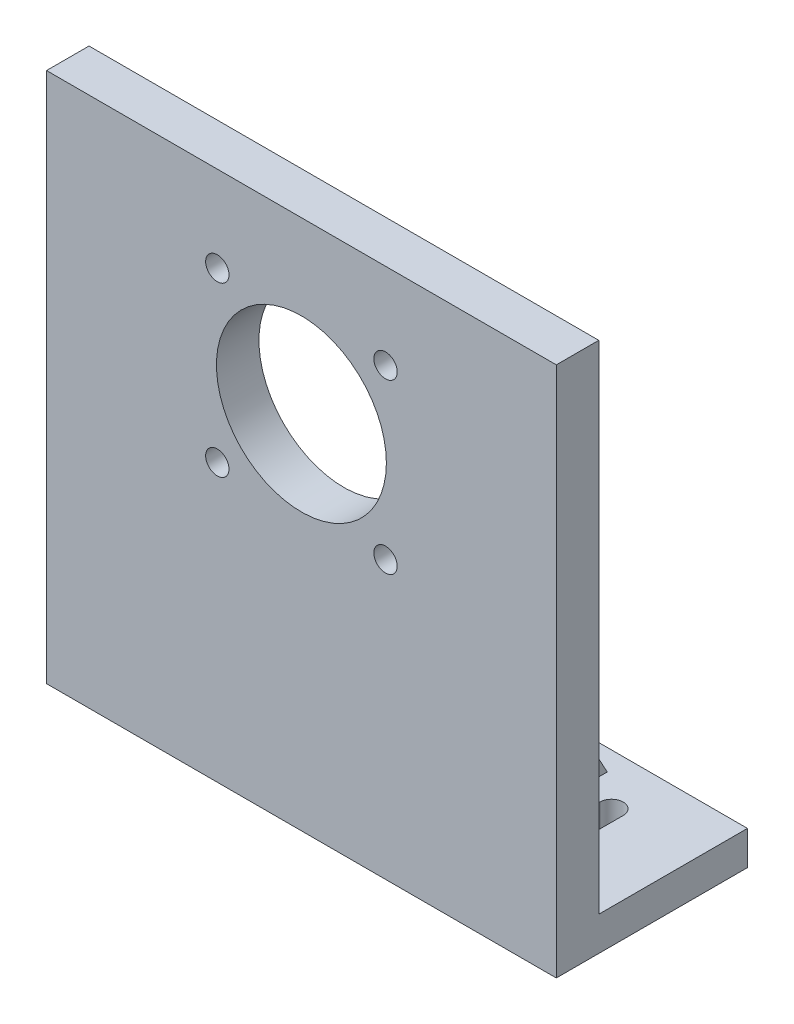
ISO-10303-21;
HEADER;
FILE_DESCRIPTION(('STEP AP214'),'2;1');
FILE_NAME('part.step','',(''),(''),'','','');
FILE_SCHEMA(('AUTOMOTIVE_DESIGN { 1 0 10303 214 1 1 1 1 }'));
ENDSEC;
DATA;
#1=APPLICATION_CONTEXT('core data for automotive mechanical design processes');
#2=APPLICATION_PROTOCOL_DEFINITION('international standard','automotive_design',2000,#1);
#3=PRODUCT_CONTEXT('',#1,'mechanical');
#4=PRODUCT('Part','Part','',(#3));
#5=PRODUCT_RELATED_PRODUCT_CATEGORY('part','',(#4));
#6=PRODUCT_DEFINITION_FORMATION('','',#4);
#7=PRODUCT_DEFINITION_CONTEXT('part definition',#1,'design');
#8=PRODUCT_DEFINITION('design','',#6,#7);
#9=PRODUCT_DEFINITION_SHAPE('','',#8);
#10=(LENGTH_UNIT() NAMED_UNIT(*) SI_UNIT(.MILLI.,.METRE.));
#11=(NAMED_UNIT(*) PLANE_ANGLE_UNIT() SI_UNIT($,.RADIAN.));
#12=(NAMED_UNIT(*) SI_UNIT($,.STERADIAN.) SOLID_ANGLE_UNIT());
#13=UNCERTAINTY_MEASURE_WITH_UNIT(LENGTH_MEASURE(1.E-05),#10,'distance_accuracy_value','');
#14=(GEOMETRIC_REPRESENTATION_CONTEXT(3) GLOBAL_UNCERTAINTY_ASSIGNED_CONTEXT((#13)) GLOBAL_UNIT_ASSIGNED_CONTEXT((#10,
#11,#12)) REPRESENTATION_CONTEXT('',''));
#15=CARTESIAN_POINT('',(0.,0.,0.));
#16=DIRECTION('',(0.,0.,1.));
#17=DIRECTION('',(1.,0.,0.));
#18=AXIS2_PLACEMENT_3D('',#15,#16,#17);
#19=CARTESIAN_POINT('',(-32.,8.,-40.));
#20=DIRECTION('',(0.,0.478852130680573,-0.877895572914384));
#21=DIRECTION('',(0.,0.877895572914384,0.478852130680573));
#22=AXIS2_PLACEMENT_3D('',#19,#20,#21);
#23=PLANE('',#22);
#24=DIRECTION('',(1.,0.,0.));
#25=VECTOR('',#24,1.);
#26=CARTESIAN_POINT('',(-32.,63.,-10.));
#27=LINE('',#26,#25);
#28=CARTESIAN_POINT('',(-32.,63.,-10.));
#29=VERTEX_POINT('',#28);
#30=CARTESIAN_POINT('',(-24.,63.,-10.));
#31=VERTEX_POINT('',#30);
#32=EDGE_CURVE('E240',#29,#31,#27,.T.);
#33=ORIENTED_EDGE('',*,*,#32,.T.);
#34=DIRECTION('',(0.,0.877895572914384,0.478852130680573));
#35=VECTOR('',#34,1.);
#36=CARTESIAN_POINT('',(-24.,8.,-40.));
#37=LINE('',#36,#35);
#38=CARTESIAN_POINT('',(-24.,8.,-40.));
#39=VERTEX_POINT('',#38);
#40=EDGE_CURVE('E194',#39,#31,#37,.T.);
#41=ORIENTED_EDGE('',*,*,#40,.F.);
#42=DIRECTION('',(1.,0.,0.));
#43=VECTOR('',#42,1.);
#44=CARTESIAN_POINT('',(-32.,8.,-40.));
#45=LINE('',#44,#43);
#46=CARTESIAN_POINT('',(-32.,8.,-40.));
#47=VERTEX_POINT('',#46);
#48=EDGE_CURVE('E200',#47,#39,#45,.T.);
#49=ORIENTED_EDGE('',*,*,#48,.F.);
#50=DIRECTION('',(0.,0.877895572914384,0.478852130680573));
#51=VECTOR('',#50,1.);
#52=CARTESIAN_POINT('',(-32.,8.,-40.));
#53=LINE('',#52,#51);
#54=EDGE_CURVE('E228',#47,#29,#53,.T.);
#55=ORIENTED_EDGE('',*,*,#54,.T.);
#56=EDGE_LOOP('',(#33,#41,#49,#55));
#57=FACE_BOUND('',#56,.T.);
#58=ADVANCED_FACE('F42',(#57),#23,.T.);
#59=CARTESIAN_POINT('',(0.,8.,0.));
#60=DIRECTION('',(0.,-1.,0.));
#61=DIRECTION('',(0.,0.,-1.));
#62=AXIS2_PLACEMENT_3D('',#59,#60,#61);
#63=PLANE('',#62);
#64=CARTESIAN_POINT('',(40.,8.,-27.5));
#65=DIRECTION('',(0.,1.,0.));
#66=DIRECTION('',(0.,0.,1.));
#67=AXIS2_PLACEMENT_3D('',#64,#65,#66);
#68=CIRCLE('',#67,2.75);
#69=CARTESIAN_POINT('',(37.25,8.,-27.5));
#70=VERTEX_POINT('',#69);
#71=CARTESIAN_POINT('',(42.75,8.,-27.5));
#72=VERTEX_POINT('',#71);
#73=EDGE_CURVE('E247',#70,#72,#68,.T.);
#74=ORIENTED_EDGE('',*,*,#73,.F.);
#75=DIRECTION('',(0.,0.,1.));
#76=VECTOR('',#75,1.);
#77=CARTESIAN_POINT('',(37.25,8.,-27.5));
#78=LINE('',#77,#76);
#79=CARTESIAN_POINT('',(37.25,8.,-33.));
#80=VERTEX_POINT('',#79);
#81=EDGE_CURVE('E258',#80,#70,#78,.T.);
#82=ORIENTED_EDGE('',*,*,#81,.F.);
#83=CARTESIAN_POINT('',(40.,8.,-33.));
#84=DIRECTION('',(0.,1.,0.));
#85=DIRECTION('',(0.,0.,1.));
#86=AXIS2_PLACEMENT_3D('',#83,#84,#85);
#87=CIRCLE('',#86,2.75);
#88=CARTESIAN_POINT('',(42.75,8.,-33.));
#89=VERTEX_POINT('',#88);
#90=EDGE_CURVE('E254',#89,#80,#87,.T.);
#91=ORIENTED_EDGE('',*,*,#90,.F.);
#92=DIRECTION('',(0.,0.,-1.));
#93=VECTOR('',#92,1.);
#94=CARTESIAN_POINT('',(42.75,8.,-27.5));
#95=LINE('',#94,#93);
#96=EDGE_CURVE('E250',#72,#89,#95,.T.);
#97=ORIENTED_EDGE('',*,*,#96,.F.);
#98=EDGE_LOOP('',(#74,#82,#91,#97));
#99=FACE_BOUND('',#98,.T.);
#100=CARTESIAN_POINT('',(-40.,8.,-27.5));
#101=DIRECTION('',(0.,1.,0.));
#102=DIRECTION('',(0.,0.,1.));
#103=AXIS2_PLACEMENT_3D('',#100,#101,#102);
#104=CIRCLE('',#103,2.75);
#105=CARTESIAN_POINT('',(-42.75,8.,-27.5));
#106=VERTEX_POINT('',#105);
#107=CARTESIAN_POINT('',(-37.25,8.,-27.5));
#108=VERTEX_POINT('',#107);
#109=EDGE_CURVE('E290',#106,#108,#104,.T.);
#110=ORIENTED_EDGE('',*,*,#109,.F.);
#111=DIRECTION('',(0.,0.,1.));
#112=VECTOR('',#111,1.);
#113=CARTESIAN_POINT('',(-42.75,8.,-27.5));
#114=LINE('',#113,#112);
#115=CARTESIAN_POINT('',(-42.75,8.,-33.));
#116=VERTEX_POINT('',#115);
#117=EDGE_CURVE('E301',#116,#106,#114,.T.);
#118=ORIENTED_EDGE('',*,*,#117,.F.);
#119=CARTESIAN_POINT('',(-40.,8.,-33.));
#120=DIRECTION('',(0.,1.,0.));
#121=DIRECTION('',(0.,0.,1.));
#122=AXIS2_PLACEMENT_3D('',#119,#120,#121);
#123=CIRCLE('',#122,2.75);
#124=CARTESIAN_POINT('',(-37.25,8.,-33.));
#125=VERTEX_POINT('',#124);
#126=EDGE_CURVE('E297',#125,#116,#123,.T.);
#127=ORIENTED_EDGE('',*,*,#126,.F.);
#128=DIRECTION('',(0.,0.,-1.));
#129=VECTOR('',#128,1.);
#130=CARTESIAN_POINT('',(-37.25,8.,-27.5));
#131=LINE('',#130,#129);
#132=EDGE_CURVE('E293',#108,#125,#131,.T.);
#133=ORIENTED_EDGE('',*,*,#132,.F.);
#134=EDGE_LOOP('',(#110,#118,#127,#133));
#135=FACE_BOUND('',#134,.T.);
#136=DIRECTION('',(0.,0.,-1.));
#137=VECTOR('',#136,1.);
#138=CARTESIAN_POINT('',(-32.,8.,-10.));
#139=LINE('',#138,#137);
#140=CARTESIAN_POINT('',(-32.,8.,-10.));
#141=VERTEX_POINT('',#140);
#142=EDGE_CURVE('E224',#141,#47,#139,.T.);
#143=ORIENTED_EDGE('',*,*,#142,.T.);
#144=ORIENTED_EDGE('',*,*,#48,.T.);
#145=DIRECTION('',(0.,0.,-1.));
#146=VECTOR('',#145,1.);
#147=CARTESIAN_POINT('',(-24.,8.,-10.));
#148=LINE('',#147,#146);
#149=CARTESIAN_POINT('',(-24.,8.,-10.));
#150=VERTEX_POINT('',#149);
#151=EDGE_CURVE('E197',#150,#39,#148,.T.);
#152=ORIENTED_EDGE('',*,*,#151,.F.);
#153=DIRECTION('',(1.,0.,0.));
#154=VECTOR('',#153,1.);
#155=CARTESIAN_POINT('',(-24.,8.,-10.));
#156=LINE('',#155,#154);
#157=CARTESIAN_POINT('',(24.,8.,-10.));
#158=VERTEX_POINT('',#157);
#159=EDGE_CURVE('E183',#150,#158,#156,.T.);
#160=ORIENTED_EDGE('',*,*,#159,.T.);
#161=DIRECTION('',(0.,0.,-1.));
#162=VECTOR('',#161,1.);
#163=CARTESIAN_POINT('',(24.,8.,-10.));
#164=LINE('',#163,#162);
#165=CARTESIAN_POINT('',(24.,8.,-40.));
#166=VERTEX_POINT('',#165);
#167=EDGE_CURVE('E211',#158,#166,#164,.T.);
#168=ORIENTED_EDGE('',*,*,#167,.T.);
#169=CARTESIAN_POINT('',(32.,8.,-40.));
#170=VERTEX_POINT('',#169);
#171=EDGE_CURVE('E232',#166,#170,#45,.T.);
#172=ORIENTED_EDGE('',*,*,#171,.T.);
#173=DIRECTION('',(0.,0.,-1.));
#174=VECTOR('',#173,1.);
#175=CARTESIAN_POINT('',(32.,8.,-10.));
#176=LINE('',#175,#174);
#177=CARTESIAN_POINT('',(32.,8.,-10.));
#178=VERTEX_POINT('',#177);
#179=EDGE_CURVE('E235',#178,#170,#176,.T.);
#180=ORIENTED_EDGE('',*,*,#179,.F.);
#181=DIRECTION('',(1.,0.,0.));
#182=VECTOR('',#181,1.);
#183=CARTESIAN_POINT('',(-60.,8.,-10.));
#184=LINE('',#183,#182);
#185=CARTESIAN_POINT('',(60.,8.,-10.));
#186=VERTEX_POINT('',#185);
#187=EDGE_CURVE('E337',#178,#186,#184,.T.);
#188=ORIENTED_EDGE('',*,*,#187,.T.);
#189=DIRECTION('',(0.,0.,-1.));
#190=VECTOR('',#189,1.);
#191=CARTESIAN_POINT('',(60.,8.,-10.));
#192=LINE('',#191,#190);
#193=CARTESIAN_POINT('',(60.,8.,-45.));
#194=VERTEX_POINT('',#193);
#195=EDGE_CURVE('E342',#186,#194,#192,.T.);
#196=ORIENTED_EDGE('',*,*,#195,.T.);
#197=DIRECTION('',(-1.,0.,0.));
#198=VECTOR('',#197,1.);
#199=CARTESIAN_POINT('',(-60.,8.,-45.));
#200=LINE('',#199,#198);
#201=CARTESIAN_POINT('',(-60.,8.,-45.));
#202=VERTEX_POINT('',#201);
#203=EDGE_CURVE('E345',#194,#202,#200,.T.);
#204=ORIENTED_EDGE('',*,*,#203,.T.);
#205=DIRECTION('',(0.,0.,1.));
#206=VECTOR('',#205,1.);
#207=CARTESIAN_POINT('',(-60.,8.,-10.));
#208=LINE('',#207,#206);
#209=CARTESIAN_POINT('',(-60.,8.,-10.));
#210=VERTEX_POINT('',#209);
#211=EDGE_CURVE('E333',#202,#210,#208,.T.);
#212=ORIENTED_EDGE('',*,*,#211,.T.);
#213=EDGE_CURVE('E338',#210,#141,#184,.T.);
#214=ORIENTED_EDGE('',*,*,#213,.T.);
#215=EDGE_LOOP('',(#143,#144,#152,#160,#168,#172,#180,#188,#196,#204,#212,#214));
#216=FACE_BOUND('',#215,.T.);
#217=ADVANCED_FACE('F199',(#99,#135,#216),#63,.F.);
#218=CARTESIAN_POINT('',(-60.,0.,-10.));
#219=DIRECTION('',(-1.,0.,0.));
#220=DIRECTION('',(0.,0.,1.));
#221=AXIS2_PLACEMENT_3D('',#218,#219,#220);
#222=PLANE('',#221);
#223=DIRECTION('',(0.,-1.,0.));
#224=VECTOR('',#223,1.);
#225=CARTESIAN_POINT('',(-60.,0.,0.));
#226=LINE('',#225,#224);
#227=CARTESIAN_POINT('',(-60.,125.,0.));
#228=VERTEX_POINT('',#227);
#229=CARTESIAN_POINT('',(-60.,0.,0.));
#230=VERTEX_POINT('',#229);
#231=EDGE_CURVE('E396',#228,#230,#226,.T.);
#232=ORIENTED_EDGE('',*,*,#231,.F.);
#233=DIRECTION('',(0.,0.,1.));
#234=VECTOR('',#233,1.);
#235=CARTESIAN_POINT('',(-60.,125.,-10.));
#236=LINE('',#235,#234);
#237=CARTESIAN_POINT('',(-60.,125.,-10.));
#238=VERTEX_POINT('',#237);
#239=EDGE_CURVE('E11',#238,#228,#236,.T.);
#240=ORIENTED_EDGE('',*,*,#239,.F.);
#241=DIRECTION('',(0.,-1.,0.));
#242=VECTOR('',#241,1.);
#243=CARTESIAN_POINT('',(-60.,0.,-10.));
#244=LINE('',#243,#242);
#245=EDGE_CURVE('E400',#238,#210,#244,.T.);
#246=ORIENTED_EDGE('',*,*,#245,.T.);
#247=ORIENTED_EDGE('',*,*,#211,.F.);
#248=DIRECTION('',(0.,-1.,0.));
#249=VECTOR('',#248,1.);
#250=CARTESIAN_POINT('',(-60.,8.,-45.));
#251=LINE('',#250,#249);
#252=CARTESIAN_POINT('',(-60.,0.,-45.));
#253=VERTEX_POINT('',#252);
#254=EDGE_CURVE('E348',#202,#253,#251,.T.);
#255=ORIENTED_EDGE('',*,*,#254,.T.);
#256=DIRECTION('',(0.,0.,1.));
#257=VECTOR('',#256,1.);
#258=CARTESIAN_POINT('',(-60.,0.,-10.));
#259=LINE('',#258,#257);
#260=EDGE_CURVE('E46',#253,#230,#259,.T.);
#261=ORIENTED_EDGE('',*,*,#260,.T.);
#262=EDGE_LOOP('',(#232,#240,#246,#247,#255,#261));
#263=FACE_BOUND('',#262,.T.);
#264=ADVANCED_FACE('F44',(#263),#222,.T.);
#265=CARTESIAN_POINT('',(-60.,125.,-10.));
#266=DIRECTION('',(0.,1.,0.));
#267=DIRECTION('',(0.,0.,1.));
#268=AXIS2_PLACEMENT_3D('',#265,#266,#267);
#269=PLANE('',#268);
#270=DIRECTION('',(-1.,0.,0.));
#271=VECTOR('',#270,1.);
#272=CARTESIAN_POINT('',(-60.,125.,0.));
#273=LINE('',#272,#271);
#274=CARTESIAN_POINT('',(60.,125.,0.));
#275=VERTEX_POINT('',#274);
#276=EDGE_CURVE('E405',#275,#228,#273,.T.);
#277=ORIENTED_EDGE('',*,*,#276,.F.);
#278=DIRECTION('',(0.,0.,1.));
#279=VECTOR('',#278,1.);
#280=CARTESIAN_POINT('',(60.,125.,-10.));
#281=LINE('',#280,#279);
#282=CARTESIAN_POINT('',(60.,125.,-10.));
#283=VERTEX_POINT('',#282);
#284=EDGE_CURVE('E52',#283,#275,#281,.T.);
#285=ORIENTED_EDGE('',*,*,#284,.F.);
#286=DIRECTION('',(-1.,0.,0.));
#287=VECTOR('',#286,1.);
#288=CARTESIAN_POINT('',(-60.,125.,-10.));
#289=LINE('',#288,#287);
#290=EDGE_CURVE('E408',#283,#238,#289,.T.);
#291=ORIENTED_EDGE('',*,*,#290,.T.);
#292=ORIENTED_EDGE('',*,*,#239,.T.);
#293=EDGE_LOOP('',(#277,#285,#291,#292));
#294=FACE_BOUND('',#293,.T.);
#295=ADVANCED_FACE('F445',(#294),#269,.T.);
#296=CARTESIAN_POINT('',(60.,0.,-10.));
#297=DIRECTION('',(1.,0.,0.));
#298=DIRECTION('',(0.,0.,-1.));
#299=AXIS2_PLACEMENT_3D('',#296,#297,#298);
#300=PLANE('',#299);
#301=DIRECTION('',(0.,1.,0.));
#302=VECTOR('',#301,1.);
#303=CARTESIAN_POINT('',(60.,0.,0.));
#304=LINE('',#303,#302);
#305=CARTESIAN_POINT('',(60.,0.,0.));
#306=VERTEX_POINT('',#305);
#307=EDGE_CURVE('E419',#306,#275,#304,.T.);
#308=ORIENTED_EDGE('',*,*,#307,.F.);
#309=DIRECTION('',(0.,0.,1.));
#310=VECTOR('',#309,1.);
#311=CARTESIAN_POINT('',(60.,0.,-10.));
#312=LINE('',#311,#310);
#313=CARTESIAN_POINT('',(60.,0.,-45.));
#314=VERTEX_POINT('',#313);
#315=EDGE_CURVE('E427',#314,#306,#312,.T.);
#316=ORIENTED_EDGE('',*,*,#315,.F.);
#317=DIRECTION('',(0.,-1.,0.));
#318=VECTOR('',#317,1.);
#319=CARTESIAN_POINT('',(60.,8.,-45.));
#320=LINE('',#319,#318);
#321=EDGE_CURVE('E355',#194,#314,#320,.T.);
#322=ORIENTED_EDGE('',*,*,#321,.F.);
#323=ORIENTED_EDGE('',*,*,#195,.F.);
#324=DIRECTION('',(0.,1.,0.));
#325=VECTOR('',#324,1.);
#326=CARTESIAN_POINT('',(60.,0.,-10.));
#327=LINE('',#326,#325);
#328=EDGE_CURVE('E404',#186,#283,#327,.T.);
#329=ORIENTED_EDGE('',*,*,#328,.T.);
#330=ORIENTED_EDGE('',*,*,#284,.T.);
#331=EDGE_LOOP('',(#308,#316,#322,#323,#329,#330));
#332=FACE_BOUND('',#331,.T.);
#333=ADVANCED_FACE('F455',(#332),#300,.T.);
#334=CARTESIAN_POINT('',(-60.,0.,-10.));
#335=DIRECTION('',(0.,-1.,0.));
#336=DIRECTION('',(0.,0.,-1.));
#337=AXIS2_PLACEMENT_3D('',#334,#335,#336);
#338=PLANE('',#337);
#339=DIRECTION('',(1.,0.,0.));
#340=VECTOR('',#339,1.);
#341=CARTESIAN_POINT('',(-60.,0.,0.));
#342=LINE('',#341,#340);
#343=EDGE_CURVE('E415',#230,#306,#342,.T.);
#344=ORIENTED_EDGE('',*,*,#343,.F.);
#345=ORIENTED_EDGE('',*,*,#260,.F.);
#346=DIRECTION('',(-1.,0.,0.));
#347=VECTOR('',#346,1.);
#348=CARTESIAN_POINT('',(-60.,0.,-45.));
#349=LINE('',#348,#347);
#350=EDGE_CURVE('E332',#314,#253,#349,.T.);
#351=ORIENTED_EDGE('',*,*,#350,.F.);
#352=ORIENTED_EDGE('',*,*,#315,.T.);
#353=EDGE_LOOP('',(#344,#345,#351,#352));
#354=FACE_BOUND('',#353,.T.);
#355=DIRECTION('',(0.,0.,1.));
#356=VECTOR('',#355,1.);
#357=CARTESIAN_POINT('',(-42.75,0.,-27.5));
#358=LINE('',#357,#356);
#359=CARTESIAN_POINT('',(-42.75,0.,-33.));
#360=VERTEX_POINT('',#359);
#361=CARTESIAN_POINT('',(-42.75,0.,-27.5));
#362=VERTEX_POINT('',#361);
#363=EDGE_CURVE('E294',#360,#362,#358,.T.);
#364=ORIENTED_EDGE('',*,*,#363,.T.);
#365=CARTESIAN_POINT('',(-40.,0.,-27.5));
#366=DIRECTION('',(0.,1.,0.));
#367=DIRECTION('',(0.,0.,1.));
#368=AXIS2_PLACEMENT_3D('',#365,#366,#367);
#369=CIRCLE('',#368,2.75);
#370=CARTESIAN_POINT('',(-37.25,0.,-27.5));
#371=VERTEX_POINT('',#370);
#372=EDGE_CURVE('E289',#362,#371,#369,.T.);
#373=ORIENTED_EDGE('',*,*,#372,.T.);
#374=DIRECTION('',(0.,0.,-1.));
#375=VECTOR('',#374,1.);
#376=CARTESIAN_POINT('',(-37.25,0.,-27.5));
#377=LINE('',#376,#375);
#378=CARTESIAN_POINT('',(-37.25,0.,-33.));
#379=VERTEX_POINT('',#378);
#380=EDGE_CURVE('E308',#371,#379,#377,.T.);
#381=ORIENTED_EDGE('',*,*,#380,.T.);
#382=CARTESIAN_POINT('',(-40.,0.,-33.));
#383=DIRECTION('',(0.,1.,0.));
#384=DIRECTION('',(0.,0.,1.));
#385=AXIS2_PLACEMENT_3D('',#382,#383,#384);
#386=CIRCLE('',#385,2.75);
#387=EDGE_CURVE('E312',#379,#360,#386,.T.);
#388=ORIENTED_EDGE('',*,*,#387,.T.);
#389=EDGE_LOOP('',(#364,#373,#381,#388));
#390=FACE_BOUND('',#389,.T.);
#391=DIRECTION('',(0.,0.,1.));
#392=VECTOR('',#391,1.);
#393=CARTESIAN_POINT('',(37.25,0.,-27.5));
#394=LINE('',#393,#392);
#395=CARTESIAN_POINT('',(37.25,0.,-33.));
#396=VERTEX_POINT('',#395);
#397=CARTESIAN_POINT('',(37.25,0.,-27.5));
#398=VERTEX_POINT('',#397);
#399=EDGE_CURVE('E251',#396,#398,#394,.T.);
#400=ORIENTED_EDGE('',*,*,#399,.T.);
#401=CARTESIAN_POINT('',(40.,0.,-27.5));
#402=DIRECTION('',(0.,1.,0.));
#403=DIRECTION('',(0.,0.,1.));
#404=AXIS2_PLACEMENT_3D('',#401,#402,#403);
#405=CIRCLE('',#404,2.75);
#406=CARTESIAN_POINT('',(42.75,0.,-27.5));
#407=VERTEX_POINT('',#406);
#408=EDGE_CURVE('E243',#398,#407,#405,.T.);
#409=ORIENTED_EDGE('',*,*,#408,.T.);
#410=DIRECTION('',(0.,0.,-1.));
#411=VECTOR('',#410,1.);
#412=CARTESIAN_POINT('',(42.75,0.,-27.5));
#413=LINE('',#412,#411);
#414=CARTESIAN_POINT('',(42.75,0.,-33.));
#415=VERTEX_POINT('',#414);
#416=EDGE_CURVE('E265',#407,#415,#413,.T.);
#417=ORIENTED_EDGE('',*,*,#416,.T.);
#418=CARTESIAN_POINT('',(40.,0.,-33.));
#419=DIRECTION('',(0.,1.,0.));
#420=DIRECTION('',(0.,0.,1.));
#421=AXIS2_PLACEMENT_3D('',#418,#419,#420);
#422=CIRCLE('',#421,2.75);
#423=EDGE_CURVE('E269',#415,#396,#422,.T.);
#424=ORIENTED_EDGE('',*,*,#423,.T.);
#425=EDGE_LOOP('',(#400,#409,#417,#424));
#426=FACE_BOUND('',#425,.T.);
#427=ADVANCED_FACE('F438',(#354,#390,#426),#338,.T.);
#428=CARTESIAN_POINT('',(0.,0.,-10.));
#429=DIRECTION('',(0.,0.,-1.));
#430=DIRECTION('',(-1.,0.,0.));
#431=AXIS2_PLACEMENT_3D('',#428,#429,#430);
#432=PLANE('',#431);
#433=CARTESIAN_POINT('',(-19.7989898732233,65.2010101267767,-10.));
#434=DIRECTION('',(0.,0.,1.));
#435=DIRECTION('',(1.,0.,0.));
#436=AXIS2_PLACEMENT_3D('',#433,#434,#435);
#437=CIRCLE('',#436,2.75);
#438=CARTESIAN_POINT('',(-17.0489898732233,65.2010101267767,-10.));
#439=VERTEX_POINT('',#438);
#440=EDGE_CURVE('E368',#439,#439,#437,.T.);
#441=ORIENTED_EDGE('',*,*,#440,.T.);
#442=EDGE_LOOP('',(#441));
#443=FACE_BOUND('',#442,.T.);
#444=CARTESIAN_POINT('',(19.7989898732233,65.2010101267767,-10.));
#445=DIRECTION('',(0.,0.,1.));
#446=DIRECTION('',(1.,0.,0.));
#447=AXIS2_PLACEMENT_3D('',#444,#445,#446);
#448=CIRCLE('',#447,2.75);
#449=CARTESIAN_POINT('',(22.5489898732233,65.2010101267767,-10.));
#450=VERTEX_POINT('',#449);
#451=EDGE_CURVE('E360',#450,#450,#448,.T.);
#452=ORIENTED_EDGE('',*,*,#451,.T.);
#453=EDGE_LOOP('',(#452));
#454=FACE_BOUND('',#453,.T.);
#455=DIRECTION('',(0.,-1.,0.));
#456=VECTOR('',#455,1.);
#457=CARTESIAN_POINT('',(-24.,63.,-10.));
#458=LINE('',#457,#456);
#459=EDGE_CURVE('E189',#31,#150,#458,.T.);
#460=ORIENTED_EDGE('',*,*,#459,.F.);
#461=ORIENTED_EDGE('',*,*,#32,.F.);
#462=DIRECTION('',(0.,-1.,0.));
#463=VECTOR('',#462,1.);
#464=CARTESIAN_POINT('',(-32.,63.,-10.));
#465=LINE('',#464,#463);
#466=EDGE_CURVE('E220',#29,#141,#465,.T.);
#467=ORIENTED_EDGE('',*,*,#466,.T.);
#468=ORIENTED_EDGE('',*,*,#213,.F.);
#469=ORIENTED_EDGE('',*,*,#245,.F.);
#470=ORIENTED_EDGE('',*,*,#290,.F.);
#471=ORIENTED_EDGE('',*,*,#328,.F.);
#472=ORIENTED_EDGE('',*,*,#187,.F.);
#473=DIRECTION('',(0.,-1.,0.));
#474=VECTOR('',#473,1.);
#475=CARTESIAN_POINT('',(32.,63.,-10.));
#476=LINE('',#475,#474);
#477=CARTESIAN_POINT('',(32.,63.,-10.));
#478=VERTEX_POINT('',#477);
#479=EDGE_CURVE('E68',#478,#178,#476,.T.);
#480=ORIENTED_EDGE('',*,*,#479,.F.);
#481=CARTESIAN_POINT('',(24.,63.,-10.));
#482=VERTEX_POINT('',#481);
#483=EDGE_CURVE('E244',#482,#478,#27,.T.);
#484=ORIENTED_EDGE('',*,*,#483,.F.);
#485=DIRECTION('',(0.,-1.,0.));
#486=VECTOR('',#485,1.);
#487=CARTESIAN_POINT('',(24.,63.,-10.));
#488=LINE('',#487,#486);
#489=EDGE_CURVE('E60',#482,#158,#488,.T.);
#490=ORIENTED_EDGE('',*,*,#489,.T.);
#491=ORIENTED_EDGE('',*,*,#159,.F.);
#492=EDGE_LOOP('',(#460,#461,#467,#468,#469,#470,#471,#472,#480,#484,#490,#491));
#493=FACE_BOUND('',#492,.T.);
#494=CARTESIAN_POINT('',(-19.7989898732233,104.798989873223,-10.));
#495=DIRECTION('',(0.,0.,1.));
#496=DIRECTION('',(1.,0.,0.));
#497=AXIS2_PLACEMENT_3D('',#494,#495,#496);
#498=CIRCLE('',#497,2.75);
#499=CARTESIAN_POINT('',(-17.0489898732233,104.798989873223,-10.));
#500=VERTEX_POINT('',#499);
#501=EDGE_CURVE('E376',#500,#500,#498,.T.);
#502=ORIENTED_EDGE('',*,*,#501,.T.);
#503=EDGE_LOOP('',(#502));
#504=FACE_BOUND('',#503,.T.);
#505=CARTESIAN_POINT('',(19.7989898732233,104.798989873223,-10.));
#506=DIRECTION('',(0.,0.,1.));
#507=DIRECTION('',(1.,0.,0.));
#508=AXIS2_PLACEMENT_3D('',#505,#506,#507);
#509=CIRCLE('',#508,2.75);
#510=CARTESIAN_POINT('',(22.5489898732233,104.798989873223,-10.));
#511=VERTEX_POINT('',#510);
#512=EDGE_CURVE('E384',#511,#511,#509,.T.);
#513=ORIENTED_EDGE('',*,*,#512,.T.);
#514=EDGE_LOOP('',(#513));
#515=FACE_BOUND('',#514,.T.);
#516=CARTESIAN_POINT('',(0.,85.,-10.));
#517=DIRECTION('',(0.,0.,1.));
#518=DIRECTION('',(1.,0.,0.));
#519=AXIS2_PLACEMENT_3D('',#516,#517,#518);
#520=CIRCLE('',#519,20.);
#521=CARTESIAN_POINT('',(20.,85.,-10.));
#522=VERTEX_POINT('',#521);
#523=EDGE_CURVE('E392',#522,#522,#520,.T.);
#524=ORIENTED_EDGE('',*,*,#523,.T.);
#525=EDGE_LOOP('',(#524));
#526=FACE_BOUND('',#525,.T.);
#527=ADVANCED_FACE('F185',(#443,#454,#493,#504,#515,#526),#432,.T.);
#528=CARTESIAN_POINT('',(0.,0.,0.));
#529=DIRECTION('',(0.,0.,-1.));
#530=DIRECTION('',(-1.,0.,0.));
#531=AXIS2_PLACEMENT_3D('',#528,#529,#530);
#532=PLANE('',#531);
#533=CARTESIAN_POINT('',(19.7989898732233,65.2010101267767,0.));
#534=DIRECTION('',(0.,0.,1.));
#535=DIRECTION('',(1.,0.,0.));
#536=AXIS2_PLACEMENT_3D('',#533,#534,#535);
#537=CIRCLE('',#536,2.75);
#538=CARTESIAN_POINT('',(22.5489898732233,65.2010101267767,0.));
#539=VERTEX_POINT('',#538);
#540=EDGE_CURVE('E359',#539,#539,#537,.T.);
#541=ORIENTED_EDGE('',*,*,#540,.F.);
#542=EDGE_LOOP('',(#541));
#543=FACE_BOUND('',#542,.T.);
#544=CARTESIAN_POINT('',(-19.7989898732233,65.2010101267767,0.));
#545=DIRECTION('',(0.,0.,1.));
#546=DIRECTION('',(1.,0.,0.));
#547=AXIS2_PLACEMENT_3D('',#544,#545,#546);
#548=CIRCLE('',#547,2.75);
#549=CARTESIAN_POINT('',(-17.0489898732233,65.2010101267767,0.));
#550=VERTEX_POINT('',#549);
#551=EDGE_CURVE('E364',#550,#550,#548,.T.);
#552=ORIENTED_EDGE('',*,*,#551,.F.);
#553=EDGE_LOOP('',(#552));
#554=FACE_BOUND('',#553,.T.);
#555=CARTESIAN_POINT('',(-19.7989898732233,104.798989873223,0.));
#556=DIRECTION('',(0.,0.,1.));
#557=DIRECTION('',(1.,0.,0.));
#558=AXIS2_PLACEMENT_3D('',#555,#556,#557);
#559=CIRCLE('',#558,2.75);
#560=CARTESIAN_POINT('',(-17.0489898732233,104.798989873223,0.));
#561=VERTEX_POINT('',#560);
#562=EDGE_CURVE('E372',#561,#561,#559,.T.);
#563=ORIENTED_EDGE('',*,*,#562,.F.);
#564=EDGE_LOOP('',(#563));
#565=FACE_BOUND('',#564,.T.);
#566=CARTESIAN_POINT('',(19.7989898732233,104.798989873223,0.));
#567=DIRECTION('',(0.,0.,1.));
#568=DIRECTION('',(1.,0.,0.));
#569=AXIS2_PLACEMENT_3D('',#566,#567,#568);
#570=CIRCLE('',#569,2.75);
#571=CARTESIAN_POINT('',(22.5489898732233,104.798989873223,0.));
#572=VERTEX_POINT('',#571);
#573=EDGE_CURVE('E380',#572,#572,#570,.T.);
#574=ORIENTED_EDGE('',*,*,#573,.F.);
#575=EDGE_LOOP('',(#574));
#576=FACE_BOUND('',#575,.T.);
#577=CARTESIAN_POINT('',(0.,85.,0.));
#578=DIRECTION('',(0.,0.,1.));
#579=DIRECTION('',(1.,0.,0.));
#580=AXIS2_PLACEMENT_3D('',#577,#578,#579);
#581=CIRCLE('',#580,20.);
#582=CARTESIAN_POINT('',(20.,85.,0.));
#583=VERTEX_POINT('',#582);
#584=EDGE_CURVE('E388',#583,#583,#581,.T.);
#585=ORIENTED_EDGE('',*,*,#584,.F.);
#586=EDGE_LOOP('',(#585));
#587=FACE_BOUND('',#586,.T.);
#588=ORIENTED_EDGE('',*,*,#231,.T.);
#589=ORIENTED_EDGE('',*,*,#343,.T.);
#590=ORIENTED_EDGE('',*,*,#307,.T.);
#591=ORIENTED_EDGE('',*,*,#276,.T.);
#592=EDGE_LOOP('',(#588,#589,#590,#591));
#593=FACE_BOUND('',#592,.T.);
#594=ADVANCED_FACE('F441',(#543,#554,#565,#576,#587,#593),#532,.F.);
#595=CARTESIAN_POINT('',(0.,85.,-10.));
#596=DIRECTION('',(0.,0.,1.));
#597=DIRECTION('',(1.,0.,0.));
#598=AXIS2_PLACEMENT_3D('',#595,#596,#597);
#599=CYLINDRICAL_SURFACE('',#598,20.);
#600=ORIENTED_EDGE('',*,*,#523,.F.);
#601=EDGE_LOOP('',(#600));
#602=FACE_BOUND('',#601,.T.);
#603=ORIENTED_EDGE('',*,*,#584,.T.);
#604=EDGE_LOOP('',(#603));
#605=FACE_BOUND('',#604,.T.);
#606=ADVANCED_FACE('F541',(#602,#605),#599,.F.);
#607=CARTESIAN_POINT('',(19.7989898732233,104.798989873223,-10.));
#608=DIRECTION('',(0.,0.,1.));
#609=DIRECTION('',(1.,0.,0.));
#610=AXIS2_PLACEMENT_3D('',#607,#608,#609);
#611=CYLINDRICAL_SURFACE('',#610,2.75);
#612=ORIENTED_EDGE('',*,*,#512,.F.);
#613=EDGE_LOOP('',(#612));
#614=FACE_BOUND('',#613,.T.);
#615=ORIENTED_EDGE('',*,*,#573,.T.);
#616=EDGE_LOOP('',(#615));
#617=FACE_BOUND('',#616,.T.);
#618=ADVANCED_FACE('F537',(#614,#617),#611,.F.);
#619=CARTESIAN_POINT('',(-19.7989898732233,104.798989873223,-10.));
#620=DIRECTION('',(0.,0.,1.));
#621=DIRECTION('',(1.,0.,0.));
#622=AXIS2_PLACEMENT_3D('',#619,#620,#621);
#623=CYLINDRICAL_SURFACE('',#622,2.75);
#624=ORIENTED_EDGE('',*,*,#501,.F.);
#625=EDGE_LOOP('',(#624));
#626=FACE_BOUND('',#625,.T.);
#627=ORIENTED_EDGE('',*,*,#562,.T.);
#628=EDGE_LOOP('',(#627));
#629=FACE_BOUND('',#628,.T.);
#630=ADVANCED_FACE('F533',(#626,#629),#623,.F.);
#631=CARTESIAN_POINT('',(-19.7989898732233,65.2010101267767,-10.));
#632=DIRECTION('',(0.,0.,1.));
#633=DIRECTION('',(1.,0.,0.));
#634=AXIS2_PLACEMENT_3D('',#631,#632,#633);
#635=CYLINDRICAL_SURFACE('',#634,2.75);
#636=ORIENTED_EDGE('',*,*,#440,.F.);
#637=EDGE_LOOP('',(#636));
#638=FACE_BOUND('',#637,.T.);
#639=ORIENTED_EDGE('',*,*,#551,.T.);
#640=EDGE_LOOP('',(#639));
#641=FACE_BOUND('',#640,.T.);
#642=ADVANCED_FACE('F529',(#638,#641),#635,.F.);
#643=CARTESIAN_POINT('',(19.7989898732233,65.2010101267767,-10.));
#644=DIRECTION('',(0.,0.,1.));
#645=DIRECTION('',(1.,0.,0.));
#646=AXIS2_PLACEMENT_3D('',#643,#644,#645);
#647=CYLINDRICAL_SURFACE('',#646,2.75);
#648=ORIENTED_EDGE('',*,*,#451,.F.);
#649=EDGE_LOOP('',(#648));
#650=FACE_BOUND('',#649,.T.);
#651=ORIENTED_EDGE('',*,*,#540,.T.);
#652=EDGE_LOOP('',(#651));
#653=FACE_BOUND('',#652,.T.);
#654=ADVANCED_FACE('F526',(#650,#653),#647,.F.);
#655=CARTESIAN_POINT('',(-60.,8.,-45.));
#656=DIRECTION('',(0.,0.,1.));
#657=DIRECTION('',(1.,0.,0.));
#658=AXIS2_PLACEMENT_3D('',#655,#656,#657);
#659=PLANE('',#658);
#660=ORIENTED_EDGE('',*,*,#350,.T.);
#661=ORIENTED_EDGE('',*,*,#254,.F.);
#662=ORIENTED_EDGE('',*,*,#203,.F.);
#663=ORIENTED_EDGE('',*,*,#321,.T.);
#664=EDGE_LOOP('',(#660,#661,#662,#663));
#665=FACE_BOUND('',#664,.T.);
#666=ADVANCED_FACE('F453',(#665),#659,.F.);
#667=CARTESIAN_POINT('',(-40.,8.,-27.5));
#668=DIRECTION('',(0.,-1.,0.));
#669=DIRECTION('',(0.,0.,-1.));
#670=AXIS2_PLACEMENT_3D('',#667,#668,#669);
#671=CYLINDRICAL_SURFACE('',#670,2.75);
#672=ORIENTED_EDGE('',*,*,#372,.F.);
#673=DIRECTION('',(0.,-1.,0.));
#674=VECTOR('',#673,1.);
#675=CARTESIAN_POINT('',(-42.75,8.,-27.5));
#676=LINE('',#675,#674);
#677=EDGE_CURVE('E304',#106,#362,#676,.T.);
#678=ORIENTED_EDGE('',*,*,#677,.F.);
#679=ORIENTED_EDGE('',*,*,#109,.T.);
#680=DIRECTION('',(0.,-1.,0.));
#681=VECTOR('',#680,1.);
#682=CARTESIAN_POINT('',(-37.25,8.,-27.5));
#683=LINE('',#682,#681);
#684=EDGE_CURVE('E328',#108,#371,#683,.T.);
#685=ORIENTED_EDGE('',*,*,#684,.T.);
#686=EDGE_LOOP('',(#672,#678,#679,#685));
#687=FACE_BOUND('',#686,.T.);
#688=ADVANCED_FACE('F519',(#687),#671,.F.);
#689=CARTESIAN_POINT('',(-37.25,8.,-27.5));
#690=DIRECTION('',(-1.,0.,0.));
#691=DIRECTION('',(0.,0.,1.));
#692=AXIS2_PLACEMENT_3D('',#689,#690,#691);
#693=PLANE('',#692);
#694=ORIENTED_EDGE('',*,*,#380,.F.);
#695=ORIENTED_EDGE('',*,*,#684,.F.);
#696=ORIENTED_EDGE('',*,*,#132,.T.);
#697=DIRECTION('',(0.,-1.,0.));
#698=VECTOR('',#697,1.);
#699=CARTESIAN_POINT('',(-37.25,8.,-33.));
#700=LINE('',#699,#698);
#701=EDGE_CURVE('E325',#125,#379,#700,.T.);
#702=ORIENTED_EDGE('',*,*,#701,.T.);
#703=EDGE_LOOP('',(#694,#695,#696,#702));
#704=FACE_BOUND('',#703,.T.);
#705=ADVANCED_FACE('F515',(#704),#693,.T.);
#706=CARTESIAN_POINT('',(-40.,8.,-33.));
#707=DIRECTION('',(0.,-1.,0.));
#708=DIRECTION('',(0.,0.,-1.));
#709=AXIS2_PLACEMENT_3D('',#706,#707,#708);
#710=CYLINDRICAL_SURFACE('',#709,2.75);
#711=ORIENTED_EDGE('',*,*,#387,.F.);
#712=ORIENTED_EDGE('',*,*,#701,.F.);
#713=ORIENTED_EDGE('',*,*,#126,.T.);
#714=DIRECTION('',(0.,-1.,0.));
#715=VECTOR('',#714,1.);
#716=CARTESIAN_POINT('',(-42.75,8.,-33.));
#717=LINE('',#716,#715);
#718=EDGE_CURVE('E322',#116,#360,#717,.T.);
#719=ORIENTED_EDGE('',*,*,#718,.T.);
#720=EDGE_LOOP('',(#711,#712,#713,#719));
#721=FACE_BOUND('',#720,.T.);
#722=ADVANCED_FACE('F511',(#721),#710,.F.);
#723=CARTESIAN_POINT('',(-42.75,8.,-27.5));
#724=DIRECTION('',(1.,0.,0.));
#725=DIRECTION('',(0.,0.,-1.));
#726=AXIS2_PLACEMENT_3D('',#723,#724,#725);
#727=PLANE('',#726);
#728=ORIENTED_EDGE('',*,*,#363,.F.);
#729=ORIENTED_EDGE('',*,*,#718,.F.);
#730=ORIENTED_EDGE('',*,*,#117,.T.);
#731=ORIENTED_EDGE('',*,*,#677,.T.);
#732=EDGE_LOOP('',(#728,#729,#730,#731));
#733=FACE_BOUND('',#732,.T.);
#734=ADVANCED_FACE('F507',(#733),#727,.T.);
#735=CARTESIAN_POINT('',(40.,8.,-27.5));
#736=DIRECTION('',(0.,-1.,0.));
#737=DIRECTION('',(0.,0.,-1.));
#738=AXIS2_PLACEMENT_3D('',#735,#736,#737);
#739=CYLINDRICAL_SURFACE('',#738,2.75);
#740=ORIENTED_EDGE('',*,*,#408,.F.);
#741=DIRECTION('',(0.,-1.,0.));
#742=VECTOR('',#741,1.);
#743=CARTESIAN_POINT('',(37.25,8.,-27.5));
#744=LINE('',#743,#742);
#745=EDGE_CURVE('E261',#70,#398,#744,.T.);
#746=ORIENTED_EDGE('',*,*,#745,.F.);
#747=ORIENTED_EDGE('',*,*,#73,.T.);
#748=DIRECTION('',(0.,-1.,0.));
#749=VECTOR('',#748,1.);
#750=CARTESIAN_POINT('',(42.75,8.,-27.5));
#751=LINE('',#750,#749);
#752=EDGE_CURVE('E285',#72,#407,#751,.T.);
#753=ORIENTED_EDGE('',*,*,#752,.T.);
#754=EDGE_LOOP('',(#740,#746,#747,#753));
#755=FACE_BOUND('',#754,.T.);
#756=ADVANCED_FACE('F503',(#755),#739,.F.);
#757=CARTESIAN_POINT('',(42.75,8.,-27.5));
#758=DIRECTION('',(-1.,0.,0.));
#759=DIRECTION('',(0.,0.,1.));
#760=AXIS2_PLACEMENT_3D('',#757,#758,#759);
#761=PLANE('',#760);
#762=ORIENTED_EDGE('',*,*,#416,.F.);
#763=ORIENTED_EDGE('',*,*,#752,.F.);
#764=ORIENTED_EDGE('',*,*,#96,.T.);
#765=DIRECTION('',(0.,-1.,0.));
#766=VECTOR('',#765,1.);
#767=CARTESIAN_POINT('',(42.75,8.,-33.));
#768=LINE('',#767,#766);
#769=EDGE_CURVE('E282',#89,#415,#768,.T.);
#770=ORIENTED_EDGE('',*,*,#769,.T.);
#771=EDGE_LOOP('',(#762,#763,#764,#770));
#772=FACE_BOUND('',#771,.T.);
#773=ADVANCED_FACE('F496',(#772),#761,.T.);
#774=CARTESIAN_POINT('',(40.,8.,-33.));
#775=DIRECTION('',(0.,-1.,0.));
#776=DIRECTION('',(0.,0.,-1.));
#777=AXIS2_PLACEMENT_3D('',#774,#775,#776);
#778=CYLINDRICAL_SURFACE('',#777,2.75);
#779=ORIENTED_EDGE('',*,*,#423,.F.);
#780=ORIENTED_EDGE('',*,*,#769,.F.);
#781=ORIENTED_EDGE('',*,*,#90,.T.);
#782=DIRECTION('',(0.,-1.,0.));
#783=VECTOR('',#782,1.);
#784=CARTESIAN_POINT('',(37.25,8.,-33.));
#785=LINE('',#784,#783);
#786=EDGE_CURVE('E279',#80,#396,#785,.T.);
#787=ORIENTED_EDGE('',*,*,#786,.T.);
#788=EDGE_LOOP('',(#779,#780,#781,#787));
#789=FACE_BOUND('',#788,.T.);
#790=ADVANCED_FACE('F491',(#789),#778,.F.);
#791=CARTESIAN_POINT('',(37.25,8.,-27.5));
#792=DIRECTION('',(1.,0.,0.));
#793=DIRECTION('',(0.,0.,-1.));
#794=AXIS2_PLACEMENT_3D('',#791,#792,#793);
#795=PLANE('',#794);
#796=ORIENTED_EDGE('',*,*,#399,.F.);
#797=ORIENTED_EDGE('',*,*,#786,.F.);
#798=ORIENTED_EDGE('',*,*,#81,.T.);
#799=ORIENTED_EDGE('',*,*,#745,.T.);
#800=EDGE_LOOP('',(#796,#797,#798,#799));
#801=FACE_BOUND('',#800,.T.);
#802=ADVANCED_FACE('F485',(#801),#795,.T.);
#803=DIRECTION('',(0.,0.877895572914384,0.478852130680573));
#804=VECTOR('',#803,1.);
#805=CARTESIAN_POINT('',(24.,8.,-40.));
#806=LINE('',#805,#804);
#807=EDGE_CURVE('E208',#166,#482,#806,.T.);
#808=ORIENTED_EDGE('',*,*,#807,.T.);
#809=ORIENTED_EDGE('',*,*,#483,.T.);
#810=DIRECTION('',(0.,0.877895572914384,0.478852130680573));
#811=VECTOR('',#810,1.);
#812=CARTESIAN_POINT('',(32.,8.,-40.));
#813=LINE('',#812,#811);
#814=EDGE_CURVE('E225',#170,#478,#813,.T.);
#815=ORIENTED_EDGE('',*,*,#814,.F.);
#816=ORIENTED_EDGE('',*,*,#171,.F.);
#817=EDGE_LOOP('',(#808,#809,#815,#816));
#818=FACE_BOUND('',#817,.T.);
#819=ADVANCED_FACE('F464',(#818),#23,.T.);
#820=CARTESIAN_POINT('',(-32.,0.,0.));
#821=DIRECTION('',(1.,0.,0.));
#822=DIRECTION('',(0.,0.,-1.));
#823=AXIS2_PLACEMENT_3D('',#820,#821,#822);
#824=PLANE('',#823);
#825=ORIENTED_EDGE('',*,*,#466,.F.);
#826=ORIENTED_EDGE('',*,*,#54,.F.);
#827=ORIENTED_EDGE('',*,*,#142,.F.);
#828=EDGE_LOOP('',(#825,#826,#827));
#829=FACE_BOUND('',#828,.T.);
#830=ADVANCED_FACE('F484',(#829),#824,.F.);
#831=CARTESIAN_POINT('',(32.,0.,0.));
#832=DIRECTION('',(1.,0.,0.));
#833=DIRECTION('',(0.,0.,-1.));
#834=AXIS2_PLACEMENT_3D('',#831,#832,#833);
#835=PLANE('',#834);
#836=ORIENTED_EDGE('',*,*,#479,.T.);
#837=ORIENTED_EDGE('',*,*,#179,.T.);
#838=ORIENTED_EDGE('',*,*,#814,.T.);
#839=EDGE_LOOP('',(#836,#837,#838));
#840=FACE_BOUND('',#839,.T.);
#841=ADVANCED_FACE('F463',(#840),#835,.T.);
#842=CARTESIAN_POINT('',(-24.,0.,0.));
#843=DIRECTION('',(1.,0.,0.));
#844=DIRECTION('',(0.,0.,-1.));
#845=AXIS2_PLACEMENT_3D('',#842,#843,#844);
#846=PLANE('',#845);
#847=ORIENTED_EDGE('',*,*,#459,.T.);
#848=ORIENTED_EDGE('',*,*,#151,.T.);
#849=ORIENTED_EDGE('',*,*,#40,.T.);
#850=EDGE_LOOP('',(#847,#848,#849));
#851=FACE_BOUND('',#850,.T.);
#852=ADVANCED_FACE('F205',(#851),#846,.T.);
#853=CARTESIAN_POINT('',(24.,0.,0.));
#854=DIRECTION('',(1.,0.,0.));
#855=DIRECTION('',(0.,0.,-1.));
#856=AXIS2_PLACEMENT_3D('',#853,#854,#855);
#857=PLANE('',#856);
#858=ORIENTED_EDGE('',*,*,#489,.F.);
#859=ORIENTED_EDGE('',*,*,#807,.F.);
#860=ORIENTED_EDGE('',*,*,#167,.F.);
#861=EDGE_LOOP('',(#858,#859,#860));
#862=FACE_BOUND('',#861,.T.);
#863=ADVANCED_FACE('F465',(#862),#857,.F.);
#864=CLOSED_SHELL('',(#58,#217,#264,#295,#333,#427,#527,#594,#606,#618,#630,#642,#654,#666,#688,
#705,#722,#734,#756,#773,#790,#802,#819,#830,#841,#852,#863));
#865=MANIFOLD_SOLID_BREP('B2',#864);
#866=ADVANCED_BREP_SHAPE_REPRESENTATION('',(#18,#865),#14);
#867=SHAPE_DEFINITION_REPRESENTATION(#9,#866);
ENDSEC;
END-ISO-10303-21;
